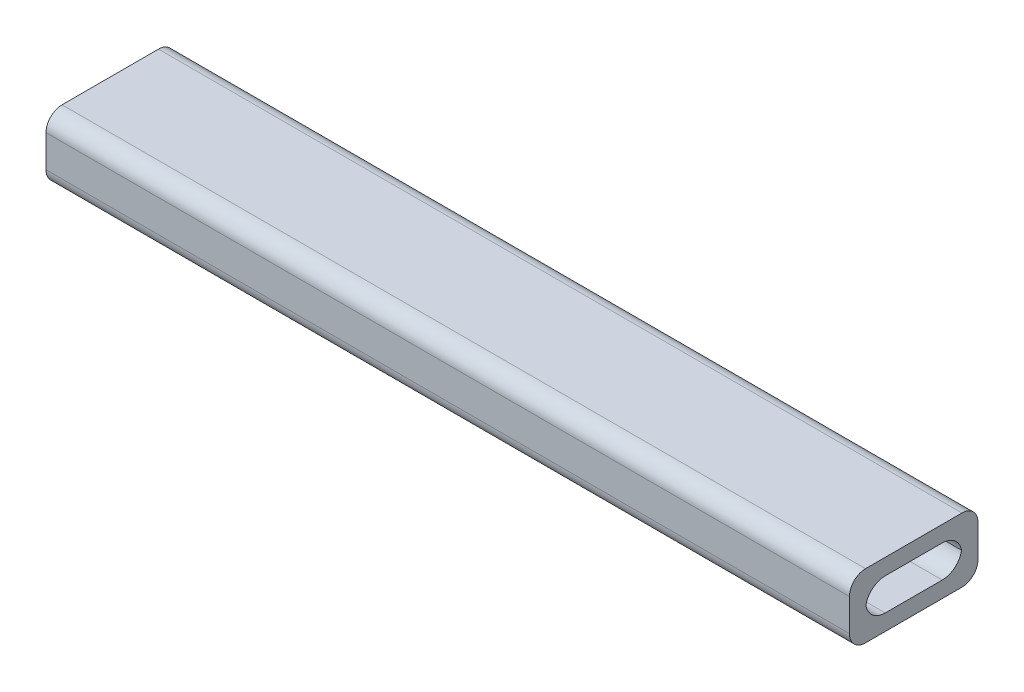
ISO-10303-21;
HEADER;
FILE_DESCRIPTION(('STEP AP214'),'2;1');
FILE_NAME('part.step','',(''),(''),'','','');
FILE_SCHEMA(('AUTOMOTIVE_DESIGN { 1 0 10303 214 1 1 1 1 }'));
ENDSEC;
DATA;
#1=APPLICATION_CONTEXT('core data for automotive mechanical design processes');
#2=APPLICATION_PROTOCOL_DEFINITION('international standard','automotive_design',2000,#1);
#3=PRODUCT_CONTEXT('',#1,'mechanical');
#4=PRODUCT('Part','Part','',(#3));
#5=PRODUCT_RELATED_PRODUCT_CATEGORY('part','',(#4));
#6=PRODUCT_DEFINITION_FORMATION('','',#4);
#7=PRODUCT_DEFINITION_CONTEXT('part definition',#1,'design');
#8=PRODUCT_DEFINITION('design','',#6,#7);
#9=PRODUCT_DEFINITION_SHAPE('','',#8);
#10=(LENGTH_UNIT() NAMED_UNIT(*) SI_UNIT(.MILLI.,.METRE.));
#11=(NAMED_UNIT(*) PLANE_ANGLE_UNIT() SI_UNIT($,.RADIAN.));
#12=(NAMED_UNIT(*) SI_UNIT($,.STERADIAN.) SOLID_ANGLE_UNIT());
#13=UNCERTAINTY_MEASURE_WITH_UNIT(LENGTH_MEASURE(1.E-05),#10,'distance_accuracy_value','');
#14=(GEOMETRIC_REPRESENTATION_CONTEXT(3) GLOBAL_UNCERTAINTY_ASSIGNED_CONTEXT((#13)) GLOBAL_UNIT_ASSIGNED_CONTEXT((#10,
#11,#12)) REPRESENTATION_CONTEXT('',''));
#15=CARTESIAN_POINT('',(0.,0.,0.));
#16=DIRECTION('',(0.,0.,1.));
#17=DIRECTION('',(1.,0.,0.));
#18=AXIS2_PLACEMENT_3D('',#15,#16,#17);
#19=CARTESIAN_POINT('',(125.,5.,15.));
#20=DIRECTION('',(-1.,0.,0.));
#21=DIRECTION('',(0.,0.,1.));
#22=AXIS2_PLACEMENT_3D('',#19,#20,#21);
#23=PLANE('',#22);
#24=CARTESIAN_POINT('',(125.,5.,15.));
#25=DIRECTION('',(1.,0.,0.));
#26=DIRECTION('',(0.,0.,1.));
#27=AXIS2_PLACEMENT_3D('',#24,#25,#26);
#28=CIRCLE('',#27,5.);
#29=CARTESIAN_POINT('',(125.,10.,15.));
#30=VERTEX_POINT('',#29);
#31=CARTESIAN_POINT('',(125.,5.,20.));
#32=VERTEX_POINT('',#31);
#33=EDGE_CURVE('E210',#30,#32,#28,.T.);
#34=ORIENTED_EDGE('',*,*,#33,.T.);
#35=DIRECTION('',(0.,-1.,0.));
#36=VECTOR('',#35,1.);
#37=CARTESIAN_POINT('',(125.,5.,20.));
#38=LINE('',#37,#36);
#39=CARTESIAN_POINT('',(125.,-5.,20.));
#40=VERTEX_POINT('',#39);
#41=EDGE_CURVE('E214',#32,#40,#38,.T.);
#42=ORIENTED_EDGE('',*,*,#41,.T.);
#43=CARTESIAN_POINT('',(125.,-5.,15.));
#44=DIRECTION('',(1.,0.,0.));
#45=DIRECTION('',(0.,0.,-1.));
#46=AXIS2_PLACEMENT_3D('',#43,#44,#45);
#47=CIRCLE('',#46,5.);
#48=CARTESIAN_POINT('',(125.,-10.,15.));
#49=VERTEX_POINT('',#48);
#50=EDGE_CURVE('E218',#40,#49,#47,.T.);
#51=ORIENTED_EDGE('',*,*,#50,.T.);
#52=DIRECTION('',(0.,0.,-1.));
#53=VECTOR('',#52,1.);
#54=CARTESIAN_POINT('',(125.,-10.,15.));
#55=LINE('',#54,#53);
#56=CARTESIAN_POINT('',(125.,-10.,-15.));
#57=VERTEX_POINT('',#56);
#58=EDGE_CURVE('E221',#49,#57,#55,.T.);
#59=ORIENTED_EDGE('',*,*,#58,.T.);
#60=CARTESIAN_POINT('',(125.,-5.,-15.));
#61=DIRECTION('',(1.,0.,0.));
#62=DIRECTION('',(0.,0.,-1.));
#63=AXIS2_PLACEMENT_3D('',#60,#61,#62);
#64=CIRCLE('',#63,5.);
#65=CARTESIAN_POINT('',(125.,-5.,-20.));
#66=VERTEX_POINT('',#65);
#67=EDGE_CURVE('E224',#57,#66,#64,.T.);
#68=ORIENTED_EDGE('',*,*,#67,.T.);
#69=DIRECTION('',(0.,1.,0.));
#70=VECTOR('',#69,1.);
#71=CARTESIAN_POINT('',(125.,5.,-20.));
#72=LINE('',#71,#70);
#73=CARTESIAN_POINT('',(125.,5.,-20.));
#74=VERTEX_POINT('',#73);
#75=EDGE_CURVE('E227',#66,#74,#72,.T.);
#76=ORIENTED_EDGE('',*,*,#75,.T.);
#77=CARTESIAN_POINT('',(125.,5.,-15.));
#78=DIRECTION('',(1.,0.,0.));
#79=DIRECTION('',(0.,0.,-1.));
#80=AXIS2_PLACEMENT_3D('',#77,#78,#79);
#81=CIRCLE('',#80,5.);
#82=CARTESIAN_POINT('',(125.,10.,-15.));
#83=VERTEX_POINT('',#82);
#84=EDGE_CURVE('E230',#74,#83,#81,.T.);
#85=ORIENTED_EDGE('',*,*,#84,.T.);
#86=DIRECTION('',(0.,0.,1.));
#87=VECTOR('',#86,1.);
#88=CARTESIAN_POINT('',(125.,10.,15.));
#89=LINE('',#88,#87);
#90=EDGE_CURVE('E233',#83,#30,#89,.T.);
#91=ORIENTED_EDGE('',*,*,#90,.T.);
#92=EDGE_LOOP('',(#34,#42,#51,#59,#68,#76,#85,#91));
#93=FACE_BOUND('',#92,.T.);
#94=CARTESIAN_POINT('',(125.,1.12966798087693,8.87033201912308));
#95=DIRECTION('',(1.,0.,0.));
#96=DIRECTION('',(0.,0.,-1.));
#97=AXIS2_PLACEMENT_3D('',#94,#95,#96);
#98=CIRCLE('',#97,6.12966798087693);
#99=CARTESIAN_POINT('',(125.,0.,14.8950046084651));
#100=VERTEX_POINT('',#99);
#101=CARTESIAN_POINT('',(125.,-5.00000000000001,8.87033201912308));
#102=VERTEX_POINT('',#101);
#103=EDGE_CURVE('E141',#100,#102,#98,.T.);
#104=ORIENTED_EDGE('',*,*,#103,.F.);
#105=CARTESIAN_POINT('',(125.,-1.12966798087694,8.87033201912308));
#106=DIRECTION('',(1.,0.,0.));
#107=DIRECTION('',(0.,0.,1.));
#108=AXIS2_PLACEMENT_3D('',#105,#106,#107);
#109=CIRCLE('',#108,6.12966798087693);
#110=CARTESIAN_POINT('',(125.,5.,8.87033201912308));
#111=VERTEX_POINT('',#110);
#112=EDGE_CURVE('E176',#111,#100,#109,.T.);
#113=ORIENTED_EDGE('',*,*,#112,.F.);
#114=DIRECTION('',(0.,0.,1.));
#115=VECTOR('',#114,1.);
#116=CARTESIAN_POINT('',(125.,5.,8.87033201912308));
#117=LINE('',#116,#115);
#118=CARTESIAN_POINT('',(125.,5.,-8.87033201912305));
#119=VERTEX_POINT('',#118);
#120=EDGE_CURVE('E173',#119,#111,#117,.T.);
#121=ORIENTED_EDGE('',*,*,#120,.F.);
#122=CARTESIAN_POINT('',(125.,-1.12966798087694,-8.87033201912305));
#123=DIRECTION('',(1.,0.,0.));
#124=DIRECTION('',(0.,0.,-1.));
#125=AXIS2_PLACEMENT_3D('',#122,#123,#124);
#126=CIRCLE('',#125,6.12966798087693);
#127=CARTESIAN_POINT('',(125.,0.,-14.8950046084651));
#128=VERTEX_POINT('',#127);
#129=EDGE_CURVE('E168',#128,#119,#126,.T.);
#130=ORIENTED_EDGE('',*,*,#129,.F.);
#131=CARTESIAN_POINT('',(125.,1.12966798087693,-8.87033201912305));
#132=DIRECTION('',(1.,0.,0.));
#133=DIRECTION('',(0.,0.,1.));
#134=AXIS2_PLACEMENT_3D('',#131,#132,#133);
#135=CIRCLE('',#134,6.12966798087693);
#136=CARTESIAN_POINT('',(125.,-5.00000000000001,-8.87033201912305));
#137=VERTEX_POINT('',#136);
#138=EDGE_CURVE('E164',#137,#128,#135,.T.);
#139=ORIENTED_EDGE('',*,*,#138,.F.);
#140=DIRECTION('',(0.,0.,-1.));
#141=VECTOR('',#140,1.);
#142=CARTESIAN_POINT('',(125.,-5.00000000000001,8.87033201912308));
#143=LINE('',#142,#141);
#144=EDGE_CURVE('E150',#102,#137,#143,.T.);
#145=ORIENTED_EDGE('',*,*,#144,.F.);
#146=EDGE_LOOP('',(#104,#113,#121,#130,#139,#145));
#147=FACE_BOUND('',#146,.T.);
#148=ADVANCED_FACE('F39',(#93,#147),#23,.F.);
#149=CARTESIAN_POINT('',(-125.,5.,15.));
#150=DIRECTION('',(-1.,0.,0.));
#151=DIRECTION('',(0.,0.,1.));
#152=AXIS2_PLACEMENT_3D('',#149,#150,#151);
#153=PLANE('',#152);
#154=CARTESIAN_POINT('',(-125.,5.,15.));
#155=DIRECTION('',(1.,0.,0.));
#156=DIRECTION('',(0.,0.,1.));
#157=AXIS2_PLACEMENT_3D('',#154,#155,#156);
#158=CIRCLE('',#157,5.);
#159=CARTESIAN_POINT('',(-125.,10.,15.));
#160=VERTEX_POINT('',#159);
#161=CARTESIAN_POINT('',(-125.,5.,20.));
#162=VERTEX_POINT('',#161);
#163=EDGE_CURVE('E159',#160,#162,#158,.T.);
#164=ORIENTED_EDGE('',*,*,#163,.F.);
#165=DIRECTION('',(0.,0.,1.));
#166=VECTOR('',#165,1.);
#167=CARTESIAN_POINT('',(-125.,10.,15.));
#168=LINE('',#167,#166);
#169=CARTESIAN_POINT('',(-125.,10.,-15.));
#170=VERTEX_POINT('',#169);
#171=EDGE_CURVE('E215',#170,#160,#168,.T.);
#172=ORIENTED_EDGE('',*,*,#171,.F.);
#173=CARTESIAN_POINT('',(-125.,5.,-15.));
#174=DIRECTION('',(1.,0.,0.));
#175=DIRECTION('',(0.,0.,-1.));
#176=AXIS2_PLACEMENT_3D('',#173,#174,#175);
#177=CIRCLE('',#176,5.);
#178=CARTESIAN_POINT('',(-125.,5.,-20.));
#179=VERTEX_POINT('',#178);
#180=EDGE_CURVE('E255',#179,#170,#177,.T.);
#181=ORIENTED_EDGE('',*,*,#180,.F.);
#182=DIRECTION('',(0.,1.,0.));
#183=VECTOR('',#182,1.);
#184=CARTESIAN_POINT('',(-125.,5.,-20.));
#185=LINE('',#184,#183);
#186=CARTESIAN_POINT('',(-125.,-5.,-20.));
#187=VERTEX_POINT('',#186);
#188=EDGE_CURVE('E252',#187,#179,#185,.T.);
#189=ORIENTED_EDGE('',*,*,#188,.F.);
#190=CARTESIAN_POINT('',(-125.,-5.,-15.));
#191=DIRECTION('',(1.,0.,0.));
#192=DIRECTION('',(0.,0.,-1.));
#193=AXIS2_PLACEMENT_3D('',#190,#191,#192);
#194=CIRCLE('',#193,5.);
#195=CARTESIAN_POINT('',(-125.,-10.,-15.));
#196=VERTEX_POINT('',#195);
#197=EDGE_CURVE('E249',#196,#187,#194,.T.);
#198=ORIENTED_EDGE('',*,*,#197,.F.);
#199=DIRECTION('',(0.,0.,-1.));
#200=VECTOR('',#199,1.);
#201=CARTESIAN_POINT('',(-125.,-10.,15.));
#202=LINE('',#201,#200);
#203=CARTESIAN_POINT('',(-125.,-10.,15.));
#204=VERTEX_POINT('',#203);
#205=EDGE_CURVE('E246',#204,#196,#202,.T.);
#206=ORIENTED_EDGE('',*,*,#205,.F.);
#207=CARTESIAN_POINT('',(-125.,-5.,15.));
#208=DIRECTION('',(1.,0.,0.));
#209=DIRECTION('',(0.,0.,-1.));
#210=AXIS2_PLACEMENT_3D('',#207,#208,#209);
#211=CIRCLE('',#210,5.);
#212=CARTESIAN_POINT('',(-125.,-5.,20.));
#213=VERTEX_POINT('',#212);
#214=EDGE_CURVE('E243',#213,#204,#211,.T.);
#215=ORIENTED_EDGE('',*,*,#214,.F.);
#216=DIRECTION('',(0.,-1.,0.));
#217=VECTOR('',#216,1.);
#218=CARTESIAN_POINT('',(-125.,5.,20.));
#219=LINE('',#218,#217);
#220=EDGE_CURVE('E240',#162,#213,#219,.T.);
#221=ORIENTED_EDGE('',*,*,#220,.F.);
#222=EDGE_LOOP('',(#164,#172,#181,#189,#198,#206,#215,#221));
#223=FACE_BOUND('',#222,.T.);
#224=CARTESIAN_POINT('',(-125.,-1.12966798087694,8.87033201912308));
#225=DIRECTION('',(1.,0.,0.));
#226=DIRECTION('',(0.,0.,1.));
#227=AXIS2_PLACEMENT_3D('',#224,#225,#226);
#228=CIRCLE('',#227,6.12966798087693);
#229=CARTESIAN_POINT('',(-125.,5.,8.87033201912308));
#230=VERTEX_POINT('',#229);
#231=CARTESIAN_POINT('',(-125.,0.,14.8950046084651));
#232=VERTEX_POINT('',#231);
#233=EDGE_CURVE('E151',#230,#232,#228,.T.);
#234=ORIENTED_EDGE('',*,*,#233,.T.);
#235=CARTESIAN_POINT('',(-125.,1.12966798087693,8.87033201912308));
#236=DIRECTION('',(1.,0.,0.));
#237=DIRECTION('',(0.,0.,-1.));
#238=AXIS2_PLACEMENT_3D('',#235,#236,#237);
#239=CIRCLE('',#238,6.12966798087693);
#240=CARTESIAN_POINT('',(-125.,-5.00000000000001,8.87033201912308));
#241=VERTEX_POINT('',#240);
#242=EDGE_CURVE('E63',#232,#241,#239,.T.);
#243=ORIENTED_EDGE('',*,*,#242,.T.);
#244=DIRECTION('',(0.,0.,-1.));
#245=VECTOR('',#244,1.);
#246=CARTESIAN_POINT('',(-125.,-5.00000000000001,8.87033201912308));
#247=LINE('',#246,#245);
#248=CARTESIAN_POINT('',(-125.,-5.00000000000001,-8.87033201912305));
#249=VERTEX_POINT('',#248);
#250=EDGE_CURVE('E157',#241,#249,#247,.T.);
#251=ORIENTED_EDGE('',*,*,#250,.T.);
#252=CARTESIAN_POINT('',(-125.,1.12966798087693,-8.87033201912305));
#253=DIRECTION('',(1.,0.,0.));
#254=DIRECTION('',(0.,0.,1.));
#255=AXIS2_PLACEMENT_3D('',#252,#253,#254);
#256=CIRCLE('',#255,6.12966798087693);
#257=CARTESIAN_POINT('',(-125.,0.,-14.8950046084651));
#258=VERTEX_POINT('',#257);
#259=EDGE_CURVE('E183',#249,#258,#256,.T.);
#260=ORIENTED_EDGE('',*,*,#259,.T.);
#261=CARTESIAN_POINT('',(-125.,-1.12966798087694,-8.87033201912305));
#262=DIRECTION('',(1.,0.,0.));
#263=DIRECTION('',(0.,0.,-1.));
#264=AXIS2_PLACEMENT_3D('',#261,#262,#263);
#265=CIRCLE('',#264,6.12966798087693);
#266=CARTESIAN_POINT('',(-125.,5.,-8.87033201912305));
#267=VERTEX_POINT('',#266);
#268=EDGE_CURVE('E187',#258,#267,#265,.T.);
#269=ORIENTED_EDGE('',*,*,#268,.T.);
#270=DIRECTION('',(0.,0.,1.));
#271=VECTOR('',#270,1.);
#272=CARTESIAN_POINT('',(-125.,5.,8.87033201912308));
#273=LINE('',#272,#271);
#274=EDGE_CURVE('E191',#267,#230,#273,.T.);
#275=ORIENTED_EDGE('',*,*,#274,.T.);
#276=EDGE_LOOP('',(#234,#243,#251,#260,#269,#275));
#277=FACE_BOUND('',#276,.T.);
#278=ADVANCED_FACE('F294',(#223,#277),#153,.T.);
#279=CARTESIAN_POINT('',(125.,5.,15.));
#280=DIRECTION('',(-1.,0.,0.));
#281=DIRECTION('',(0.,0.,1.));
#282=AXIS2_PLACEMENT_3D('',#279,#280,#281);
#283=CYLINDRICAL_SURFACE('',#282,5.);
#284=ORIENTED_EDGE('',*,*,#163,.T.);
#285=DIRECTION('',(-1.,0.,0.));
#286=VECTOR('',#285,1.);
#287=CARTESIAN_POINT('',(125.,5.,20.));
#288=LINE('',#287,#286);
#289=EDGE_CURVE('E11',#32,#162,#288,.T.);
#290=ORIENTED_EDGE('',*,*,#289,.F.);
#291=ORIENTED_EDGE('',*,*,#33,.F.);
#292=DIRECTION('',(-1.,0.,0.));
#293=VECTOR('',#292,1.);
#294=CARTESIAN_POINT('',(125.,10.,15.));
#295=LINE('',#294,#293);
#296=EDGE_CURVE('E236',#30,#160,#295,.T.);
#297=ORIENTED_EDGE('',*,*,#296,.T.);
#298=EDGE_LOOP('',(#284,#290,#291,#297));
#299=FACE_BOUND('',#298,.T.);
#300=ADVANCED_FACE('F41',(#299),#283,.T.);
#301=CARTESIAN_POINT('',(125.,5.,20.));
#302=DIRECTION('',(0.,0.,-1.));
#303=DIRECTION('',(0.,1.,0.));
#304=AXIS2_PLACEMENT_3D('',#301,#302,#303);
#305=PLANE('',#304);
#306=ORIENTED_EDGE('',*,*,#220,.T.);
#307=DIRECTION('',(-1.,0.,0.));
#308=VECTOR('',#307,1.);
#309=CARTESIAN_POINT('',(125.,-5.,20.));
#310=LINE('',#309,#308);
#311=EDGE_CURVE('E48',#40,#213,#310,.T.);
#312=ORIENTED_EDGE('',*,*,#311,.F.);
#313=ORIENTED_EDGE('',*,*,#41,.F.);
#314=ORIENTED_EDGE('',*,*,#289,.T.);
#315=EDGE_LOOP('',(#306,#312,#313,#314));
#316=FACE_BOUND('',#315,.T.);
#317=ADVANCED_FACE('F311',(#316),#305,.F.);
#318=CARTESIAN_POINT('',(125.,-5.,15.));
#319=DIRECTION('',(-1.,0.,0.));
#320=DIRECTION('',(0.,0.,1.));
#321=AXIS2_PLACEMENT_3D('',#318,#319,#320);
#322=CYLINDRICAL_SURFACE('',#321,5.);
#323=ORIENTED_EDGE('',*,*,#214,.T.);
#324=DIRECTION('',(-1.,0.,0.));
#325=VECTOR('',#324,1.);
#326=CARTESIAN_POINT('',(125.,-10.,15.));
#327=LINE('',#326,#325);
#328=EDGE_CURVE('E279',#49,#204,#327,.T.);
#329=ORIENTED_EDGE('',*,*,#328,.F.);
#330=ORIENTED_EDGE('',*,*,#50,.F.);
#331=ORIENTED_EDGE('',*,*,#311,.T.);
#332=EDGE_LOOP('',(#323,#329,#330,#331));
#333=FACE_BOUND('',#332,.T.);
#334=ADVANCED_FACE('F288',(#333),#322,.T.);
#335=CARTESIAN_POINT('',(125.,-10.,15.));
#336=DIRECTION('',(0.,1.,0.));
#337=DIRECTION('',(0.,0.,1.));
#338=AXIS2_PLACEMENT_3D('',#335,#336,#337);
#339=PLANE('',#338);
#340=ORIENTED_EDGE('',*,*,#205,.T.);
#341=DIRECTION('',(-1.,0.,0.));
#342=VECTOR('',#341,1.);
#343=CARTESIAN_POINT('',(125.,-10.,-15.));
#344=LINE('',#343,#342);
#345=EDGE_CURVE('E275',#57,#196,#344,.T.);
#346=ORIENTED_EDGE('',*,*,#345,.F.);
#347=ORIENTED_EDGE('',*,*,#58,.F.);
#348=ORIENTED_EDGE('',*,*,#328,.T.);
#349=EDGE_LOOP('',(#340,#346,#347,#348));
#350=FACE_BOUND('',#349,.T.);
#351=ADVANCED_FACE('F300',(#350),#339,.F.);
#352=CARTESIAN_POINT('',(125.,-5.,-15.));
#353=DIRECTION('',(-1.,0.,0.));
#354=DIRECTION('',(0.,0.,1.));
#355=AXIS2_PLACEMENT_3D('',#352,#353,#354);
#356=CYLINDRICAL_SURFACE('',#355,5.);
#357=ORIENTED_EDGE('',*,*,#197,.T.);
#358=DIRECTION('',(-1.,0.,0.));
#359=VECTOR('',#358,1.);
#360=CARTESIAN_POINT('',(125.,-5.,-20.));
#361=LINE('',#360,#359);
#362=EDGE_CURVE('E271',#66,#187,#361,.T.);
#363=ORIENTED_EDGE('',*,*,#362,.F.);
#364=ORIENTED_EDGE('',*,*,#67,.F.);
#365=ORIENTED_EDGE('',*,*,#345,.T.);
#366=EDGE_LOOP('',(#357,#363,#364,#365));
#367=FACE_BOUND('',#366,.T.);
#368=ADVANCED_FACE('F304',(#367),#356,.T.);
#369=CARTESIAN_POINT('',(125.,5.,-20.));
#370=DIRECTION('',(0.,0.,1.));
#371=DIRECTION('',(0.,-1.,0.));
#372=AXIS2_PLACEMENT_3D('',#369,#370,#371);
#373=PLANE('',#372);
#374=ORIENTED_EDGE('',*,*,#188,.T.);
#375=DIRECTION('',(-1.,0.,0.));
#376=VECTOR('',#375,1.);
#377=CARTESIAN_POINT('',(125.,5.,-20.));
#378=LINE('',#377,#376);
#379=EDGE_CURVE('E267',#74,#179,#378,.T.);
#380=ORIENTED_EDGE('',*,*,#379,.F.);
#381=ORIENTED_EDGE('',*,*,#75,.F.);
#382=ORIENTED_EDGE('',*,*,#362,.T.);
#383=EDGE_LOOP('',(#374,#380,#381,#382));
#384=FACE_BOUND('',#383,.T.);
#385=ADVANCED_FACE('F324',(#384),#373,.F.);
#386=CARTESIAN_POINT('',(125.,5.,-15.));
#387=DIRECTION('',(-1.,0.,0.));
#388=DIRECTION('',(0.,0.,1.));
#389=AXIS2_PLACEMENT_3D('',#386,#387,#388);
#390=CYLINDRICAL_SURFACE('',#389,5.);
#391=ORIENTED_EDGE('',*,*,#180,.T.);
#392=DIRECTION('',(-1.,0.,0.));
#393=VECTOR('',#392,1.);
#394=CARTESIAN_POINT('',(125.,10.,-15.));
#395=LINE('',#394,#393);
#396=EDGE_CURVE('E263',#83,#170,#395,.T.);
#397=ORIENTED_EDGE('',*,*,#396,.F.);
#398=ORIENTED_EDGE('',*,*,#84,.F.);
#399=ORIENTED_EDGE('',*,*,#379,.T.);
#400=EDGE_LOOP('',(#391,#397,#398,#399));
#401=FACE_BOUND('',#400,.T.);
#402=ADVANCED_FACE('F322',(#401),#390,.T.);
#403=CARTESIAN_POINT('',(125.,10.,15.));
#404=DIRECTION('',(0.,-1.,0.));
#405=DIRECTION('',(0.,0.,-1.));
#406=AXIS2_PLACEMENT_3D('',#403,#404,#405);
#407=PLANE('',#406);
#408=ORIENTED_EDGE('',*,*,#171,.T.);
#409=ORIENTED_EDGE('',*,*,#296,.F.);
#410=ORIENTED_EDGE('',*,*,#90,.F.);
#411=ORIENTED_EDGE('',*,*,#396,.T.);
#412=EDGE_LOOP('',(#408,#409,#410,#411));
#413=FACE_BOUND('',#412,.T.);
#414=ADVANCED_FACE('F317',(#413),#407,.F.);
#415=CARTESIAN_POINT('',(125.,1.12966798087693,8.87033201912308));
#416=DIRECTION('',(-1.,0.,0.));
#417=DIRECTION('',(0.,0.,1.));
#418=AXIS2_PLACEMENT_3D('',#415,#416,#417);
#419=CYLINDRICAL_SURFACE('',#418,6.12966798087693);
#420=ORIENTED_EDGE('',*,*,#242,.F.);
#421=DIRECTION('',(-1.,0.,0.));
#422=VECTOR('',#421,1.);
#423=CARTESIAN_POINT('',(125.,0.,14.8950046084651));
#424=LINE('',#423,#422);
#425=EDGE_CURVE('E145',#100,#232,#424,.T.);
#426=ORIENTED_EDGE('',*,*,#425,.F.);
#427=ORIENTED_EDGE('',*,*,#103,.T.);
#428=DIRECTION('',(-1.,0.,0.));
#429=VECTOR('',#428,1.);
#430=CARTESIAN_POINT('',(125.,-5.00000000000001,8.87033201912308));
#431=LINE('',#430,#429);
#432=EDGE_CURVE('E144',#102,#241,#431,.T.);
#433=ORIENTED_EDGE('',*,*,#432,.T.);
#434=EDGE_LOOP('',(#420,#426,#427,#433));
#435=FACE_BOUND('',#434,.T.);
#436=ADVANCED_FACE('F143',(#435),#419,.F.);
#437=CARTESIAN_POINT('',(125.,-5.00000000000001,8.87033201912308));
#438=DIRECTION('',(0.,1.,0.));
#439=DIRECTION('',(0.,0.,1.));
#440=AXIS2_PLACEMENT_3D('',#437,#438,#439);
#441=PLANE('',#440);
#442=ORIENTED_EDGE('',*,*,#250,.F.);
#443=ORIENTED_EDGE('',*,*,#432,.F.);
#444=ORIENTED_EDGE('',*,*,#144,.T.);
#445=DIRECTION('',(-1.,0.,0.));
#446=VECTOR('',#445,1.);
#447=CARTESIAN_POINT('',(125.,-5.00000000000001,-8.87033201912305));
#448=LINE('',#447,#446);
#449=EDGE_CURVE('E160',#137,#249,#448,.T.);
#450=ORIENTED_EDGE('',*,*,#449,.T.);
#451=EDGE_LOOP('',(#442,#443,#444,#450));
#452=FACE_BOUND('',#451,.T.);
#453=ADVANCED_FACE('F154',(#452),#441,.T.);
#454=CARTESIAN_POINT('',(125.,1.12966798087693,-8.87033201912305));
#455=DIRECTION('',(-1.,0.,0.));
#456=DIRECTION('',(0.,0.,1.));
#457=AXIS2_PLACEMENT_3D('',#454,#455,#456);
#458=CYLINDRICAL_SURFACE('',#457,6.12966798087693);
#459=ORIENTED_EDGE('',*,*,#259,.F.);
#460=ORIENTED_EDGE('',*,*,#449,.F.);
#461=ORIENTED_EDGE('',*,*,#138,.T.);
#462=DIRECTION('',(-1.,0.,0.));
#463=VECTOR('',#462,1.);
#464=CARTESIAN_POINT('',(125.,0.,-14.8950046084651));
#465=LINE('',#464,#463);
#466=EDGE_CURVE('E205',#128,#258,#465,.T.);
#467=ORIENTED_EDGE('',*,*,#466,.T.);
#468=EDGE_LOOP('',(#459,#460,#461,#467));
#469=FACE_BOUND('',#468,.T.);
#470=ADVANCED_FACE('F349',(#469),#458,.F.);
#471=CARTESIAN_POINT('',(125.,-1.12966798087694,-8.87033201912305));
#472=DIRECTION('',(-1.,0.,0.));
#473=DIRECTION('',(0.,0.,1.));
#474=AXIS2_PLACEMENT_3D('',#471,#472,#473);
#475=CYLINDRICAL_SURFACE('',#474,6.12966798087693);
#476=ORIENTED_EDGE('',*,*,#268,.F.);
#477=ORIENTED_EDGE('',*,*,#466,.F.);
#478=ORIENTED_EDGE('',*,*,#129,.T.);
#479=DIRECTION('',(-1.,0.,0.));
#480=VECTOR('',#479,1.);
#481=CARTESIAN_POINT('',(125.,5.,-8.87033201912305));
#482=LINE('',#481,#480);
#483=EDGE_CURVE('E202',#119,#267,#482,.T.);
#484=ORIENTED_EDGE('',*,*,#483,.T.);
#485=EDGE_LOOP('',(#476,#477,#478,#484));
#486=FACE_BOUND('',#485,.T.);
#487=ADVANCED_FACE('F353',(#486),#475,.F.);
#488=CARTESIAN_POINT('',(125.,5.,8.87033201912308));
#489=DIRECTION('',(0.,-1.,0.));
#490=DIRECTION('',(0.,0.,-1.));
#491=AXIS2_PLACEMENT_3D('',#488,#489,#490);
#492=PLANE('',#491);
#493=ORIENTED_EDGE('',*,*,#274,.F.);
#494=ORIENTED_EDGE('',*,*,#483,.F.);
#495=ORIENTED_EDGE('',*,*,#120,.T.);
#496=DIRECTION('',(-1.,0.,0.));
#497=VECTOR('',#496,1.);
#498=CARTESIAN_POINT('',(125.,5.,8.87033201912308));
#499=LINE('',#498,#497);
#500=EDGE_CURVE('E55',#111,#230,#499,.T.);
#501=ORIENTED_EDGE('',*,*,#500,.T.);
#502=EDGE_LOOP('',(#493,#494,#495,#501));
#503=FACE_BOUND('',#502,.T.);
#504=ADVANCED_FACE('F359',(#503),#492,.T.);
#505=CARTESIAN_POINT('',(125.,-1.12966798087694,8.87033201912308));
#506=DIRECTION('',(-1.,0.,0.));
#507=DIRECTION('',(0.,0.,1.));
#508=AXIS2_PLACEMENT_3D('',#505,#506,#507);
#509=CYLINDRICAL_SURFACE('',#508,6.12966798087693);
#510=ORIENTED_EDGE('',*,*,#233,.F.);
#511=ORIENTED_EDGE('',*,*,#500,.F.);
#512=ORIENTED_EDGE('',*,*,#112,.T.);
#513=ORIENTED_EDGE('',*,*,#425,.T.);
#514=EDGE_LOOP('',(#510,#511,#512,#513));
#515=FACE_BOUND('',#514,.T.);
#516=ADVANCED_FACE('F363',(#515),#509,.F.);
#517=CLOSED_SHELL('',(#148,#278,#300,#317,#334,#351,#368,#385,#402,#414,#436,#453,#470,#487,
#504,#516));
#518=MANIFOLD_SOLID_BREP('B2',#517);
#519=ADVANCED_BREP_SHAPE_REPRESENTATION('',(#18,#518),#14);
#520=SHAPE_DEFINITION_REPRESENTATION(#9,#519);
ENDSEC;
END-ISO-10303-21;
